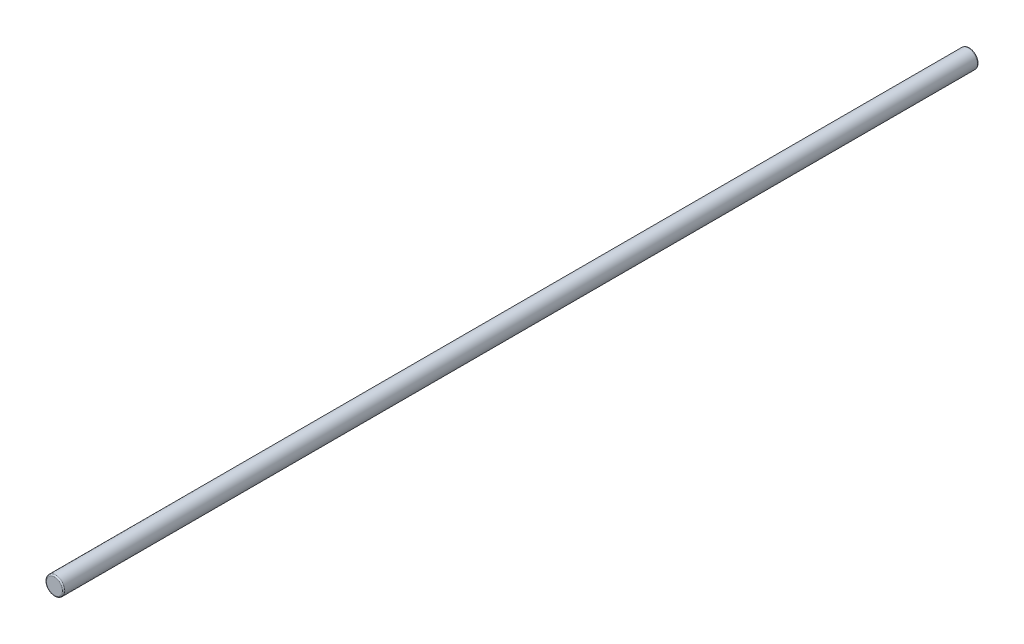
ISO-10303-21;
HEADER;
FILE_DESCRIPTION(('STEP AP214'),'2;1');
FILE_NAME('part.step','',(''),(''),'','','');
FILE_SCHEMA(('AUTOMOTIVE_DESIGN { 1 0 10303 214 1 1 1 1 }'));
ENDSEC;
DATA;
#1=APPLICATION_CONTEXT('core data for automotive mechanical design processes');
#2=APPLICATION_PROTOCOL_DEFINITION('international standard','automotive_design',2000,#1);
#3=PRODUCT_CONTEXT('',#1,'mechanical');
#4=PRODUCT('Part','Part','',(#3));
#5=PRODUCT_RELATED_PRODUCT_CATEGORY('part','',(#4));
#6=PRODUCT_DEFINITION_FORMATION('','',#4);
#7=PRODUCT_DEFINITION_CONTEXT('part definition',#1,'design');
#8=PRODUCT_DEFINITION('design','',#6,#7);
#9=PRODUCT_DEFINITION_SHAPE('','',#8);
#10=(LENGTH_UNIT() NAMED_UNIT(*) SI_UNIT(.MILLI.,.METRE.));
#11=(NAMED_UNIT(*) PLANE_ANGLE_UNIT() SI_UNIT($,.RADIAN.));
#12=(NAMED_UNIT(*) SI_UNIT($,.STERADIAN.) SOLID_ANGLE_UNIT());
#13=UNCERTAINTY_MEASURE_WITH_UNIT(LENGTH_MEASURE(1.E-05),#10,'distance_accuracy_value','');
#14=(GEOMETRIC_REPRESENTATION_CONTEXT(3) GLOBAL_UNCERTAINTY_ASSIGNED_CONTEXT((#13)) GLOBAL_UNIT_ASSIGNED_CONTEXT((#10,
#11,#12)) REPRESENTATION_CONTEXT('',''));
#15=CARTESIAN_POINT('',(0.,0.,0.));
#16=DIRECTION('',(0.,0.,1.));
#17=DIRECTION('',(1.,0.,0.));
#18=AXIS2_PLACEMENT_3D('',#15,#16,#17);
#19=CARTESIAN_POINT('',(0.,0.,150.));
#20=DIRECTION('',(0.,0.,-1.));
#21=DIRECTION('',(-1.,0.,0.));
#22=AXIS2_PLACEMENT_3D('',#19,#20,#21);
#23=CYLINDRICAL_SURFACE('',#22,1.5);
#24=CARTESIAN_POINT('',(0.,0.,0.200000000000006));
#25=DIRECTION('',(0.,0.,1.));
#26=DIRECTION('',(1.,0.,0.));
#27=AXIS2_PLACEMENT_3D('',#24,#25,#26);
#28=CIRCLE('',#27,1.5);
#29=CARTESIAN_POINT('',(1.5,0.,0.200000000000006));
#30=VERTEX_POINT('',#29);
#31=EDGE_CURVE('E41',#30,#30,#28,.T.);
#32=ORIENTED_EDGE('',*,*,#31,.T.);
#33=EDGE_LOOP('',(#32));
#34=FACE_BOUND('',#33,.T.);
#35=CARTESIAN_POINT('',(0.,0.,149.8));
#36=DIRECTION('',(0.,0.,1.));
#37=DIRECTION('',(1.,0.,0.));
#38=AXIS2_PLACEMENT_3D('',#35,#36,#37);
#39=CIRCLE('',#38,1.5);
#40=CARTESIAN_POINT('',(1.5,0.,149.8));
#41=VERTEX_POINT('',#40);
#42=EDGE_CURVE('E45',#41,#41,#39,.F.);
#43=ORIENTED_EDGE('',*,*,#42,.T.);
#44=EDGE_LOOP('',(#43));
#45=FACE_BOUND('',#44,.T.);
#46=ADVANCED_FACE('F34',(#34,#45),#23,.T.);
#47=CARTESIAN_POINT('',(0.,0.,150.));
#48=DIRECTION('',(0.,0.,1.));
#49=DIRECTION('',(1.,0.,0.));
#50=AXIS2_PLACEMENT_3D('',#47,#48,#49);
#51=PLANE('',#50);
#52=CARTESIAN_POINT('',(0.,0.,150.));
#53=DIRECTION('',(0.,0.,1.));
#54=DIRECTION('',(1.,0.,0.));
#55=AXIS2_PLACEMENT_3D('',#52,#53,#54);
#56=CIRCLE('',#55,1.3);
#57=CARTESIAN_POINT('',(1.3,0.,150.));
#58=VERTEX_POINT('',#57);
#59=EDGE_CURVE('E49',#58,#58,#56,.T.);
#60=ORIENTED_EDGE('',*,*,#59,.T.);
#61=EDGE_LOOP('',(#60));
#62=FACE_BOUND('',#61,.T.);
#63=ADVANCED_FACE('F55',(#62),#51,.T.);
#64=CARTESIAN_POINT('',(0.,0.,0.));
#65=DIRECTION('',(0.,0.,1.));
#66=DIRECTION('',(1.,0.,0.));
#67=AXIS2_PLACEMENT_3D('',#64,#65,#66);
#68=PLANE('',#67);
#69=CARTESIAN_POINT('',(0.,0.,0.));
#70=DIRECTION('',(0.,0.,1.));
#71=DIRECTION('',(1.,0.,0.));
#72=AXIS2_PLACEMENT_3D('',#69,#70,#71);
#73=CIRCLE('',#72,1.3);
#74=CARTESIAN_POINT('',(1.3,0.,0.));
#75=VERTEX_POINT('',#74);
#76=EDGE_CURVE('E10',#75,#75,#73,.F.);
#77=ORIENTED_EDGE('',*,*,#76,.T.);
#78=EDGE_LOOP('',(#77));
#79=FACE_BOUND('',#78,.T.);
#80=ADVANCED_FACE('F59',(#79),#68,.F.);
#81=CARTESIAN_POINT('',(0.,0.,149.8));
#82=DIRECTION('',(0.,0.,1.));
#83=DIRECTION('',(1.,0.,0.));
#84=AXIS2_PLACEMENT_3D('',#81,#82,#83);
#85=TOROIDAL_SURFACE('',#84,1.3,0.2);
#86=ORIENTED_EDGE('',*,*,#42,.F.);
#87=EDGE_LOOP('',(#86));
#88=FACE_BOUND('',#87,.T.);
#89=ORIENTED_EDGE('',*,*,#59,.F.);
#90=EDGE_LOOP('',(#89));
#91=FACE_BOUND('',#90,.T.);
#92=ADVANCED_FACE('F57',(#88,#91),#85,.T.);
#93=CARTESIAN_POINT('',(0.,0.,0.200000000000006));
#94=DIRECTION('',(0.,0.,1.));
#95=DIRECTION('',(1.,0.,0.));
#96=AXIS2_PLACEMENT_3D('',#93,#94,#95);
#97=TOROIDAL_SURFACE('',#96,1.3,0.2);
#98=ORIENTED_EDGE('',*,*,#76,.F.);
#99=EDGE_LOOP('',(#98));
#100=FACE_BOUND('',#99,.T.);
#101=ORIENTED_EDGE('',*,*,#31,.F.);
#102=EDGE_LOOP('',(#101));
#103=FACE_BOUND('',#102,.T.);
#104=ADVANCED_FACE('F36',(#100,#103),#97,.T.);
#105=CLOSED_SHELL('',(#46,#63,#80,#92,#104));
#106=MANIFOLD_SOLID_BREP('B2',#105);
#107=ADVANCED_BREP_SHAPE_REPRESENTATION('',(#18,#106),#14);
#108=SHAPE_DEFINITION_REPRESENTATION(#9,#107);
ENDSEC;
END-ISO-10303-21;
